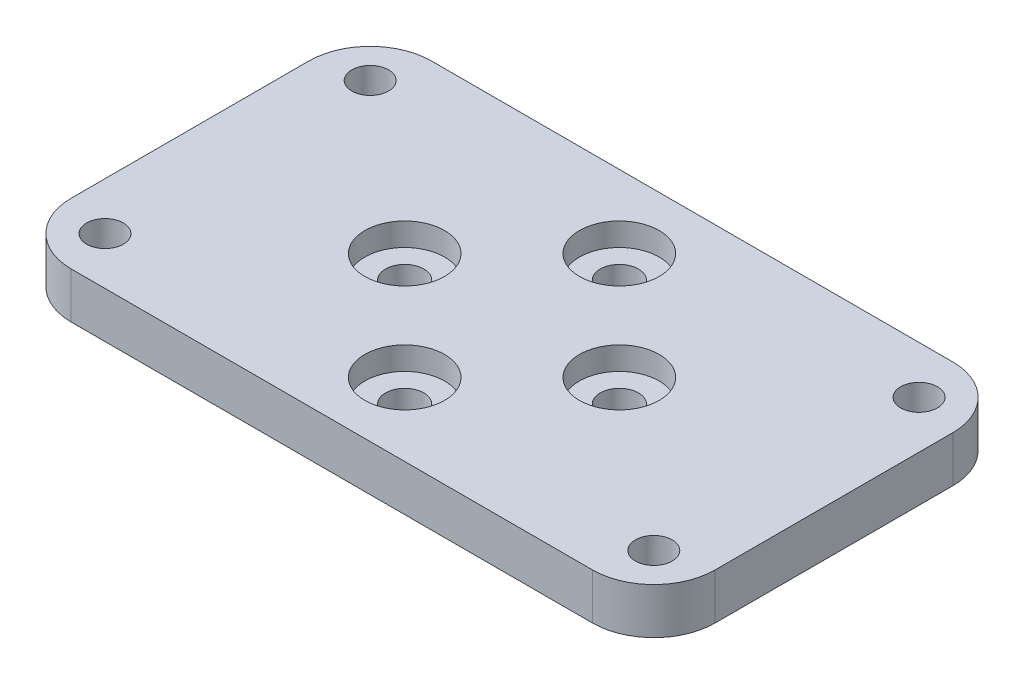
ISO-10303-21;
HEADER;
FILE_DESCRIPTION(('STEP AP214'),'2;1');
FILE_NAME('part.step','',(''),(''),'','','');
FILE_SCHEMA(('AUTOMOTIVE_DESIGN { 1 0 10303 214 1 1 1 1 }'));
ENDSEC;
DATA;
#1=APPLICATION_CONTEXT('core data for automotive mechanical design processes');
#2=APPLICATION_PROTOCOL_DEFINITION('international standard','automotive_design',2000,#1);
#3=PRODUCT_CONTEXT('',#1,'mechanical');
#4=PRODUCT('Part','Part','',(#3));
#5=PRODUCT_RELATED_PRODUCT_CATEGORY('part','',(#4));
#6=PRODUCT_DEFINITION_FORMATION('','',#4);
#7=PRODUCT_DEFINITION_CONTEXT('part definition',#1,'design');
#8=PRODUCT_DEFINITION('design','',#6,#7);
#9=PRODUCT_DEFINITION_SHAPE('','',#8);
#10=(LENGTH_UNIT() NAMED_UNIT(*) SI_UNIT(.MILLI.,.METRE.));
#11=(NAMED_UNIT(*) PLANE_ANGLE_UNIT() SI_UNIT($,.RADIAN.));
#12=(NAMED_UNIT(*) SI_UNIT($,.STERADIAN.) SOLID_ANGLE_UNIT());
#13=UNCERTAINTY_MEASURE_WITH_UNIT(LENGTH_MEASURE(1.E-05),#10,'distance_accuracy_value','');
#14=(GEOMETRIC_REPRESENTATION_CONTEXT(3) GLOBAL_UNCERTAINTY_ASSIGNED_CONTEXT((#13)) GLOBAL_UNIT_ASSIGNED_CONTEXT((#10,
#11,#12)) REPRESENTATION_CONTEXT('',''));
#15=CARTESIAN_POINT('',(0.,0.,0.));
#16=DIRECTION('',(0.,0.,1.));
#17=DIRECTION('',(1.,0.,0.));
#18=AXIS2_PLACEMENT_3D('',#15,#16,#17);
#19=CARTESIAN_POINT('',(7.,3.,0.));
#20=DIRECTION('',(0.,-1.,0.));
#21=DIRECTION('',(0.,0.,-1.));
#22=AXIS2_PLACEMENT_3D('',#19,#20,#21);
#23=CYLINDRICAL_SURFACE('',#22,1.25);
#24=CARTESIAN_POINT('',(7.,0.,0.));
#25=DIRECTION('',(0.,1.,0.));
#26=DIRECTION('',(0.,0.,1.));
#27=AXIS2_PLACEMENT_3D('',#24,#25,#26);
#28=CIRCLE('',#27,1.25);
#29=CARTESIAN_POINT('',(7.,0.,1.25));
#30=VERTEX_POINT('',#29);
#31=EDGE_CURVE('E141',#30,#30,#28,.T.);
#32=ORIENTED_EDGE('',*,*,#31,.F.);
#33=EDGE_LOOP('',(#32));
#34=FACE_BOUND('',#33,.T.);
#35=CARTESIAN_POINT('',(7.,1.5,0.));
#36=DIRECTION('',(0.,1.,0.));
#37=DIRECTION('',(0.,0.,1.));
#38=AXIS2_PLACEMENT_3D('',#35,#36,#37);
#39=CIRCLE('',#38,1.25);
#40=CARTESIAN_POINT('',(7.,1.5,1.25));
#41=VERTEX_POINT('',#40);
#42=EDGE_CURVE('E45',#41,#41,#39,.T.);
#43=ORIENTED_EDGE('',*,*,#42,.T.);
#44=EDGE_LOOP('',(#43));
#45=FACE_BOUND('',#44,.T.);
#46=ADVANCED_FACE('F41',(#34,#45),#23,.F.);
#47=CARTESIAN_POINT('',(0.,3.,7.));
#48=DIRECTION('',(0.,-1.,0.));
#49=DIRECTION('',(0.,0.,-1.));
#50=AXIS2_PLACEMENT_3D('',#47,#48,#49);
#51=CYLINDRICAL_SURFACE('',#50,1.25);
#52=CARTESIAN_POINT('',(0.,0.,7.));
#53=DIRECTION('',(0.,1.,0.));
#54=DIRECTION('',(0.,0.,1.));
#55=AXIS2_PLACEMENT_3D('',#52,#53,#54);
#56=CIRCLE('',#55,1.25);
#57=CARTESIAN_POINT('',(0.,0.,8.25));
#58=VERTEX_POINT('',#57);
#59=EDGE_CURVE('E247',#58,#58,#56,.T.);
#60=ORIENTED_EDGE('',*,*,#59,.F.);
#61=EDGE_LOOP('',(#60));
#62=FACE_BOUND('',#61,.T.);
#63=CARTESIAN_POINT('',(0.,1.5,7.));
#64=DIRECTION('',(0.,1.,0.));
#65=DIRECTION('',(0.,0.,1.));
#66=AXIS2_PLACEMENT_3D('',#63,#64,#65);
#67=CIRCLE('',#66,1.25);
#68=CARTESIAN_POINT('',(0.,1.5,8.25));
#69=VERTEX_POINT('',#68);
#70=EDGE_CURVE('E202',#69,#69,#67,.T.);
#71=ORIENTED_EDGE('',*,*,#70,.T.);
#72=EDGE_LOOP('',(#71));
#73=FACE_BOUND('',#72,.T.);
#74=ADVANCED_FACE('F296',(#62,#73),#51,.F.);
#75=CARTESIAN_POINT('',(-7.,3.,0.));
#76=DIRECTION('',(0.,-1.,0.));
#77=DIRECTION('',(0.,0.,-1.));
#78=AXIS2_PLACEMENT_3D('',#75,#76,#77);
#79=CYLINDRICAL_SURFACE('',#78,1.25);
#80=CARTESIAN_POINT('',(-7.,0.,0.));
#81=DIRECTION('',(0.,1.,0.));
#82=DIRECTION('',(0.,0.,1.));
#83=AXIS2_PLACEMENT_3D('',#80,#81,#82);
#84=CIRCLE('',#83,1.25);
#85=CARTESIAN_POINT('',(-7.,0.,1.24999999999995));
#86=VERTEX_POINT('',#85);
#87=EDGE_CURVE('E243',#86,#86,#84,.T.);
#88=ORIENTED_EDGE('',*,*,#87,.F.);
#89=EDGE_LOOP('',(#88));
#90=FACE_BOUND('',#89,.T.);
#91=CARTESIAN_POINT('',(-7.,1.5,0.));
#92=DIRECTION('',(0.,1.,0.));
#93=DIRECTION('',(0.,0.,1.));
#94=AXIS2_PLACEMENT_3D('',#91,#92,#93);
#95=CIRCLE('',#94,1.25);
#96=CARTESIAN_POINT('',(-7.,1.5,1.24999999999995));
#97=VERTEX_POINT('',#96);
#98=EDGE_CURVE('E198',#97,#97,#95,.T.);
#99=ORIENTED_EDGE('',*,*,#98,.T.);
#100=EDGE_LOOP('',(#99));
#101=FACE_BOUND('',#100,.T.);
#102=ADVANCED_FACE('F302',(#90,#101),#79,.F.);
#103=CARTESIAN_POINT('',(0.,3.,-7.));
#104=DIRECTION('',(0.,-1.,0.));
#105=DIRECTION('',(0.,0.,-1.));
#106=AXIS2_PLACEMENT_3D('',#103,#104,#105);
#107=CYLINDRICAL_SURFACE('',#106,1.25);
#108=CARTESIAN_POINT('',(0.,0.,-7.));
#109=DIRECTION('',(0.,1.,0.));
#110=DIRECTION('',(0.,0.,1.));
#111=AXIS2_PLACEMENT_3D('',#108,#109,#110);
#112=CIRCLE('',#111,1.25);
#113=CARTESIAN_POINT('',(0.,0.,-5.75));
#114=VERTEX_POINT('',#113);
#115=EDGE_CURVE('E236',#114,#114,#112,.T.);
#116=ORIENTED_EDGE('',*,*,#115,.F.);
#117=EDGE_LOOP('',(#116));
#118=FACE_BOUND('',#117,.T.);
#119=CARTESIAN_POINT('',(0.,1.5,-7.));
#120=DIRECTION('',(0.,1.,0.));
#121=DIRECTION('',(0.,0.,1.));
#122=AXIS2_PLACEMENT_3D('',#119,#120,#121);
#123=CIRCLE('',#122,1.25);
#124=CARTESIAN_POINT('',(0.,1.5,-5.75));
#125=VERTEX_POINT('',#124);
#126=EDGE_CURVE('E194',#125,#125,#123,.T.);
#127=ORIENTED_EDGE('',*,*,#126,.T.);
#128=EDGE_LOOP('',(#127));
#129=FACE_BOUND('',#128,.T.);
#130=ADVANCED_FACE('F311',(#118,#129),#107,.F.);
#131=CARTESIAN_POINT('',(0.,3.,0.));
#132=DIRECTION('',(0.,1.,0.));
#133=DIRECTION('',(0.,0.,1.));
#134=AXIS2_PLACEMENT_3D('',#131,#132,#133);
#135=PLANE('',#134);
#136=CARTESIAN_POINT('',(7.,3.,0.));
#137=DIRECTION('',(0.,1.,0.));
#138=DIRECTION('',(0.,0.,1.));
#139=AXIS2_PLACEMENT_3D('',#136,#137,#138);
#140=CIRCLE('',#139,2.6);
#141=CARTESIAN_POINT('',(7.,3.,2.6));
#142=VERTEX_POINT('',#141);
#143=EDGE_CURVE('E511',#142,#142,#140,.T.);
#144=ORIENTED_EDGE('',*,*,#143,.F.);
#145=EDGE_LOOP('',(#144));
#146=FACE_BOUND('',#145,.T.);
#147=CARTESIAN_POINT('',(0.,3.,7.));
#148=DIRECTION('',(0.,1.,0.));
#149=DIRECTION('',(0.,0.,1.));
#150=AXIS2_PLACEMENT_3D('',#147,#148,#149);
#151=CIRCLE('',#150,2.6);
#152=CARTESIAN_POINT('',(0.,3.,9.6));
#153=VERTEX_POINT('',#152);
#154=EDGE_CURVE('E521',#153,#153,#151,.T.);
#155=ORIENTED_EDGE('',*,*,#154,.F.);
#156=EDGE_LOOP('',(#155));
#157=FACE_BOUND('',#156,.T.);
#158=CARTESIAN_POINT('',(-7.,3.,0.));
#159=DIRECTION('',(0.,1.,0.));
#160=DIRECTION('',(0.,0.,1.));
#161=AXIS2_PLACEMENT_3D('',#158,#159,#160);
#162=CIRCLE('',#161,2.6);
#163=CARTESIAN_POINT('',(-7.,3.,2.59999999999995));
#164=VERTEX_POINT('',#163);
#165=EDGE_CURVE('E529',#164,#164,#162,.T.);
#166=ORIENTED_EDGE('',*,*,#165,.F.);
#167=EDGE_LOOP('',(#166));
#168=FACE_BOUND('',#167,.T.);
#169=CARTESIAN_POINT('',(0.,3.,-7.));
#170=DIRECTION('',(0.,1.,0.));
#171=DIRECTION('',(0.,0.,1.));
#172=AXIS2_PLACEMENT_3D('',#169,#170,#171);
#173=CIRCLE('',#172,2.6);
#174=CARTESIAN_POINT('',(0.,3.,-4.4));
#175=VERTEX_POINT('',#174);
#176=EDGE_CURVE('E536',#175,#175,#173,.T.);
#177=ORIENTED_EDGE('',*,*,#176,.F.);
#178=EDGE_LOOP('',(#177));
#179=FACE_BOUND('',#178,.T.);
#180=CARTESIAN_POINT('',(-17.9,3.,8.65));
#181=DIRECTION('',(0.,1.,0.));
#182=DIRECTION('',(0.,0.,-1.));
#183=AXIS2_PLACEMENT_3D('',#180,#181,#182);
#184=CIRCLE('',#183,1.2);
#185=CARTESIAN_POINT('',(-17.9,3.,7.45));
#186=VERTEX_POINT('',#185);
#187=EDGE_CURVE('E224',#186,#186,#184,.T.);
#188=ORIENTED_EDGE('',*,*,#187,.F.);
#189=EDGE_LOOP('',(#188));
#190=FACE_BOUND('',#189,.T.);
#191=DIRECTION('',(-1.,0.,0.));
#192=VECTOR('',#191,1.);
#193=CARTESIAN_POINT('',(21.,3.,-11.75));
#194=LINE('',#193,#192);
#195=CARTESIAN_POINT('',(17.,3.,-11.75));
#196=VERTEX_POINT('',#195);
#197=CARTESIAN_POINT('',(-17.,3.,-11.75));
#198=VERTEX_POINT('',#197);
#199=EDGE_CURVE('E152',#196,#198,#194,.T.);
#200=ORIENTED_EDGE('',*,*,#199,.T.);
#201=CARTESIAN_POINT('',(-17.,3.,-7.75));
#202=DIRECTION('',(0.,1.,0.));
#203=DIRECTION('',(0.,0.,1.));
#204=AXIS2_PLACEMENT_3D('',#201,#202,#203);
#205=CIRCLE('',#204,4.);
#206=CARTESIAN_POINT('',(-21.,3.,-7.75));
#207=VERTEX_POINT('',#206);
#208=EDGE_CURVE('E182',#198,#207,#205,.T.);
#209=ORIENTED_EDGE('',*,*,#208,.T.);
#210=DIRECTION('',(0.,0.,1.));
#211=VECTOR('',#210,1.);
#212=CARTESIAN_POINT('',(-21.,3.,11.75));
#213=LINE('',#212,#211);
#214=CARTESIAN_POINT('',(-21.,3.,7.75));
#215=VERTEX_POINT('',#214);
#216=EDGE_CURVE('E131',#207,#215,#213,.T.);
#217=ORIENTED_EDGE('',*,*,#216,.T.);
#218=CARTESIAN_POINT('',(-17.,3.,7.75));
#219=DIRECTION('',(0.,1.,0.));
#220=DIRECTION('',(0.,0.,1.));
#221=AXIS2_PLACEMENT_3D('',#218,#219,#220);
#222=CIRCLE('',#221,4.);
#223=CARTESIAN_POINT('',(-17.,3.,11.75));
#224=VERTEX_POINT('',#223);
#225=EDGE_CURVE('E179',#215,#224,#222,.T.);
#226=ORIENTED_EDGE('',*,*,#225,.T.);
#227=DIRECTION('',(1.,0.,0.));
#228=VECTOR('',#227,1.);
#229=CARTESIAN_POINT('',(21.,3.,11.75));
#230=LINE('',#229,#228);
#231=CARTESIAN_POINT('',(17.,3.,11.75));
#232=VERTEX_POINT('',#231);
#233=EDGE_CURVE('E260',#224,#232,#230,.T.);
#234=ORIENTED_EDGE('',*,*,#233,.T.);
#235=CARTESIAN_POINT('',(17.,3.,7.75));
#236=DIRECTION('',(0.,1.,0.));
#237=DIRECTION('',(0.,0.,1.));
#238=AXIS2_PLACEMENT_3D('',#235,#236,#237);
#239=CIRCLE('',#238,4.);
#240=CARTESIAN_POINT('',(21.,3.,7.75));
#241=VERTEX_POINT('',#240);
#242=EDGE_CURVE('E65',#232,#241,#239,.T.);
#243=ORIENTED_EDGE('',*,*,#242,.T.);
#244=DIRECTION('',(0.,0.,-1.));
#245=VECTOR('',#244,1.);
#246=CARTESIAN_POINT('',(21.,3.,11.75));
#247=LINE('',#246,#245);
#248=CARTESIAN_POINT('',(21.,3.,-7.75));
#249=VERTEX_POINT('',#248);
#250=EDGE_CURVE('E262',#241,#249,#247,.T.);
#251=ORIENTED_EDGE('',*,*,#250,.T.);
#252=CARTESIAN_POINT('',(17.,3.,-7.75));
#253=DIRECTION('',(0.,1.,0.));
#254=DIRECTION('',(0.,0.,1.));
#255=AXIS2_PLACEMENT_3D('',#252,#253,#254);
#256=CIRCLE('',#255,4.);
#257=EDGE_CURVE('E174',#249,#196,#256,.T.);
#258=ORIENTED_EDGE('',*,*,#257,.T.);
#259=EDGE_LOOP('',(#200,#209,#217,#226,#234,#243,#251,#258));
#260=FACE_BOUND('',#259,.T.);
#261=CARTESIAN_POINT('',(-17.9,3.,-8.65));
#262=DIRECTION('',(0.,1.,0.));
#263=DIRECTION('',(0.,0.,1.));
#264=AXIS2_PLACEMENT_3D('',#261,#262,#263);
#265=CIRCLE('',#264,1.2);
#266=CARTESIAN_POINT('',(-17.9,3.,-7.45));
#267=VERTEX_POINT('',#266);
#268=EDGE_CURVE('E149',#267,#267,#265,.T.);
#269=ORIENTED_EDGE('',*,*,#268,.F.);
#270=EDGE_LOOP('',(#269));
#271=FACE_BOUND('',#270,.T.);
#272=CARTESIAN_POINT('',(17.9,3.,-8.65000000000001));
#273=DIRECTION('',(0.,1.,0.));
#274=DIRECTION('',(0.,0.,-1.));
#275=AXIS2_PLACEMENT_3D('',#272,#273,#274);
#276=CIRCLE('',#275,1.2);
#277=CARTESIAN_POINT('',(17.9,3.,-9.85));
#278=VERTEX_POINT('',#277);
#279=EDGE_CURVE('E232',#278,#278,#276,.T.);
#280=ORIENTED_EDGE('',*,*,#279,.F.);
#281=EDGE_LOOP('',(#280));
#282=FACE_BOUND('',#281,.T.);
#283=CARTESIAN_POINT('',(17.9,3.,8.65000000000001));
#284=DIRECTION('',(0.,1.,0.));
#285=DIRECTION('',(0.,0.,1.));
#286=AXIS2_PLACEMENT_3D('',#283,#284,#285);
#287=CIRCLE('',#286,1.2);
#288=CARTESIAN_POINT('',(17.9,3.,9.85));
#289=VERTEX_POINT('',#288);
#290=EDGE_CURVE('E214',#289,#289,#287,.T.);
#291=ORIENTED_EDGE('',*,*,#290,.F.);
#292=EDGE_LOOP('',(#291));
#293=FACE_BOUND('',#292,.T.);
#294=ADVANCED_FACE('F268',(#146,#157,#168,#179,#190,#260,#271,#282,#293),#135,.T.);
#295=CARTESIAN_POINT('',(0.,0.,0.));
#296=DIRECTION('',(0.,1.,0.));
#297=DIRECTION('',(0.,0.,1.));
#298=AXIS2_PLACEMENT_3D('',#295,#296,#297);
#299=PLANE('',#298);
#300=DIRECTION('',(0.,0.,1.));
#301=VECTOR('',#300,1.);
#302=CARTESIAN_POINT('',(-21.,0.,11.75));
#303=LINE('',#302,#301);
#304=CARTESIAN_POINT('',(-21.,0.,-7.75));
#305=VERTEX_POINT('',#304);
#306=CARTESIAN_POINT('',(-21.,0.,7.75));
#307=VERTEX_POINT('',#306);
#308=EDGE_CURVE('E128',#305,#307,#303,.T.);
#309=ORIENTED_EDGE('',*,*,#308,.F.);
#310=CARTESIAN_POINT('',(-17.,0.,-7.75));
#311=DIRECTION('',(0.,1.,0.));
#312=DIRECTION('',(0.,0.,1.));
#313=AXIS2_PLACEMENT_3D('',#310,#311,#312);
#314=CIRCLE('',#313,4.);
#315=CARTESIAN_POINT('',(-17.,0.,-11.75));
#316=VERTEX_POINT('',#315);
#317=EDGE_CURVE('E110',#305,#316,#314,.F.);
#318=ORIENTED_EDGE('',*,*,#317,.T.);
#319=DIRECTION('',(-1.,0.,0.));
#320=VECTOR('',#319,1.);
#321=CARTESIAN_POINT('',(21.,0.,-11.75));
#322=LINE('',#321,#320);
#323=CARTESIAN_POINT('',(17.,0.,-11.75));
#324=VERTEX_POINT('',#323);
#325=EDGE_CURVE('E157',#324,#316,#322,.T.);
#326=ORIENTED_EDGE('',*,*,#325,.F.);
#327=CARTESIAN_POINT('',(17.,0.,-7.75));
#328=DIRECTION('',(0.,1.,0.));
#329=DIRECTION('',(0.,0.,1.));
#330=AXIS2_PLACEMENT_3D('',#327,#328,#329);
#331=CIRCLE('',#330,4.);
#332=CARTESIAN_POINT('',(21.,0.,-7.75));
#333=VERTEX_POINT('',#332);
#334=EDGE_CURVE('E133',#324,#333,#331,.F.);
#335=ORIENTED_EDGE('',*,*,#334,.T.);
#336=DIRECTION('',(0.,0.,-1.));
#337=VECTOR('',#336,1.);
#338=CARTESIAN_POINT('',(21.,0.,11.75));
#339=LINE('',#338,#337);
#340=CARTESIAN_POINT('',(21.,0.,7.75));
#341=VERTEX_POINT('',#340);
#342=EDGE_CURVE('E146',#341,#333,#339,.T.);
#343=ORIENTED_EDGE('',*,*,#342,.F.);
#344=CARTESIAN_POINT('',(17.,0.,7.75));
#345=DIRECTION('',(0.,1.,0.));
#346=DIRECTION('',(0.,0.,1.));
#347=AXIS2_PLACEMENT_3D('',#344,#345,#346);
#348=CIRCLE('',#347,4.);
#349=CARTESIAN_POINT('',(17.,0.,11.75));
#350=VERTEX_POINT('',#349);
#351=EDGE_CURVE('E164',#341,#350,#348,.F.);
#352=ORIENTED_EDGE('',*,*,#351,.T.);
#353=DIRECTION('',(1.,0.,0.));
#354=VECTOR('',#353,1.);
#355=CARTESIAN_POINT('',(21.,0.,11.75));
#356=LINE('',#355,#354);
#357=CARTESIAN_POINT('',(-17.,0.,11.75));
#358=VERTEX_POINT('',#357);
#359=EDGE_CURVE('E140',#358,#350,#356,.T.);
#360=ORIENTED_EDGE('',*,*,#359,.F.);
#361=CARTESIAN_POINT('',(-17.,0.,7.75));
#362=DIRECTION('',(0.,1.,0.));
#363=DIRECTION('',(0.,0.,1.));
#364=AXIS2_PLACEMENT_3D('',#361,#362,#363);
#365=CIRCLE('',#364,4.);
#366=EDGE_CURVE('E122',#358,#307,#365,.F.);
#367=ORIENTED_EDGE('',*,*,#366,.T.);
#368=EDGE_LOOP('',(#309,#318,#326,#335,#343,#352,#360,#367));
#369=FACE_BOUND('',#368,.T.);
#370=ORIENTED_EDGE('',*,*,#31,.T.);
#371=EDGE_LOOP('',(#370));
#372=FACE_BOUND('',#371,.T.);
#373=CARTESIAN_POINT('',(-17.9,0.,-8.65));
#374=DIRECTION('',(0.,1.,0.));
#375=DIRECTION('',(0.,0.,1.));
#376=AXIS2_PLACEMENT_3D('',#373,#374,#375);
#377=CIRCLE('',#376,1.2);
#378=CARTESIAN_POINT('',(-17.9,0.,-7.45));
#379=VERTEX_POINT('',#378);
#380=EDGE_CURVE('E251',#379,#379,#377,.T.);
#381=ORIENTED_EDGE('',*,*,#380,.T.);
#382=EDGE_LOOP('',(#381));
#383=FACE_BOUND('',#382,.T.);
#384=ORIENTED_EDGE('',*,*,#59,.T.);
#385=EDGE_LOOP('',(#384));
#386=FACE_BOUND('',#385,.T.);
#387=ORIENTED_EDGE('',*,*,#87,.T.);
#388=EDGE_LOOP('',(#387));
#389=FACE_BOUND('',#388,.T.);
#390=ORIENTED_EDGE('',*,*,#115,.T.);
#391=EDGE_LOOP('',(#390));
#392=FACE_BOUND('',#391,.T.);
#393=CARTESIAN_POINT('',(17.9,0.,-8.65000000000001));
#394=DIRECTION('',(0.,1.,0.));
#395=DIRECTION('',(0.,0.,-1.));
#396=AXIS2_PLACEMENT_3D('',#393,#394,#395);
#397=CIRCLE('',#396,1.2);
#398=CARTESIAN_POINT('',(17.9,0.,-9.85));
#399=VERTEX_POINT('',#398);
#400=EDGE_CURVE('E228',#399,#399,#397,.T.);
#401=ORIENTED_EDGE('',*,*,#400,.T.);
#402=EDGE_LOOP('',(#401));
#403=FACE_BOUND('',#402,.T.);
#404=CARTESIAN_POINT('',(-17.9,0.,8.65));
#405=DIRECTION('',(0.,1.,0.));
#406=DIRECTION('',(0.,0.,-1.));
#407=AXIS2_PLACEMENT_3D('',#404,#405,#406);
#408=CIRCLE('',#407,1.2);
#409=CARTESIAN_POINT('',(-17.9,0.,7.45));
#410=VERTEX_POINT('',#409);
#411=EDGE_CURVE('E220',#410,#410,#408,.T.);
#412=ORIENTED_EDGE('',*,*,#411,.T.);
#413=EDGE_LOOP('',(#412));
#414=FACE_BOUND('',#413,.T.);
#415=CARTESIAN_POINT('',(17.9,0.,8.65000000000001));
#416=DIRECTION('',(0.,1.,0.));
#417=DIRECTION('',(0.,0.,1.));
#418=AXIS2_PLACEMENT_3D('',#415,#416,#417);
#419=CIRCLE('',#418,1.2);
#420=CARTESIAN_POINT('',(17.9,0.,9.85));
#421=VERTEX_POINT('',#420);
#422=EDGE_CURVE('E209',#421,#421,#419,.T.);
#423=ORIENTED_EDGE('',*,*,#422,.T.);
#424=EDGE_LOOP('',(#423));
#425=FACE_BOUND('',#424,.T.);
#426=ADVANCED_FACE('F136',(#369,#372,#383,#386,#389,#392,#403,#414,#425),#299,.F.);
#427=CARTESIAN_POINT('',(-21.,3.,11.75));
#428=DIRECTION('',(1.,0.,0.));
#429=DIRECTION('',(0.,0.,-1.));
#430=AXIS2_PLACEMENT_3D('',#427,#428,#429);
#431=PLANE('',#430);
#432=ORIENTED_EDGE('',*,*,#216,.F.);
#433=DIRECTION('',(0.,-1.,0.));
#434=VECTOR('',#433,1.);
#435=CARTESIAN_POINT('',(-21.,3.,-7.75));
#436=LINE('',#435,#434);
#437=EDGE_CURVE('E114',#207,#305,#436,.T.);
#438=ORIENTED_EDGE('',*,*,#437,.T.);
#439=ORIENTED_EDGE('',*,*,#308,.T.);
#440=DIRECTION('',(0.,-1.,0.));
#441=VECTOR('',#440,1.);
#442=CARTESIAN_POINT('',(-21.,3.,7.75));
#443=LINE('',#442,#441);
#444=EDGE_CURVE('E134',#307,#215,#443,.F.);
#445=ORIENTED_EDGE('',*,*,#444,.T.);
#446=EDGE_LOOP('',(#432,#438,#439,#445));
#447=FACE_BOUND('',#446,.T.);
#448=ADVANCED_FACE('F127',(#447),#431,.F.);
#449=CARTESIAN_POINT('',(21.,3.,11.75));
#450=DIRECTION('',(0.,0.,-1.));
#451=DIRECTION('',(-1.,0.,0.));
#452=AXIS2_PLACEMENT_3D('',#449,#450,#451);
#453=PLANE('',#452);
#454=ORIENTED_EDGE('',*,*,#233,.F.);
#455=DIRECTION('',(0.,-1.,0.));
#456=VECTOR('',#455,1.);
#457=CARTESIAN_POINT('',(-17.,3.,11.75));
#458=LINE('',#457,#456);
#459=EDGE_CURVE('E188',#224,#358,#458,.T.);
#460=ORIENTED_EDGE('',*,*,#459,.T.);
#461=ORIENTED_EDGE('',*,*,#359,.T.);
#462=DIRECTION('',(0.,-1.,0.));
#463=VECTOR('',#462,1.);
#464=CARTESIAN_POINT('',(17.,3.,11.75));
#465=LINE('',#464,#463);
#466=EDGE_CURVE('E185',#350,#232,#465,.F.);
#467=ORIENTED_EDGE('',*,*,#466,.T.);
#468=EDGE_LOOP('',(#454,#460,#461,#467));
#469=FACE_BOUND('',#468,.T.);
#470=ADVANCED_FACE('F282',(#469),#453,.F.);
#471=CARTESIAN_POINT('',(21.,3.,11.75));
#472=DIRECTION('',(-1.,0.,0.));
#473=DIRECTION('',(0.,0.,1.));
#474=AXIS2_PLACEMENT_3D('',#471,#472,#473);
#475=PLANE('',#474);
#476=ORIENTED_EDGE('',*,*,#250,.F.);
#477=DIRECTION('',(0.,-1.,0.));
#478=VECTOR('',#477,1.);
#479=CARTESIAN_POINT('',(21.,3.,7.75));
#480=LINE('',#479,#478);
#481=EDGE_CURVE('E11',#241,#341,#480,.T.);
#482=ORIENTED_EDGE('',*,*,#481,.T.);
#483=ORIENTED_EDGE('',*,*,#342,.T.);
#484=DIRECTION('',(0.,-1.,0.));
#485=VECTOR('',#484,1.);
#486=CARTESIAN_POINT('',(21.,3.,-7.75));
#487=LINE('',#486,#485);
#488=EDGE_CURVE('E51',#333,#249,#487,.F.);
#489=ORIENTED_EDGE('',*,*,#488,.T.);
#490=EDGE_LOOP('',(#476,#482,#483,#489));
#491=FACE_BOUND('',#490,.T.);
#492=ADVANCED_FACE('F275',(#491),#475,.F.);
#493=CARTESIAN_POINT('',(21.,3.,-11.75));
#494=DIRECTION('',(0.,0.,1.));
#495=DIRECTION('',(1.,0.,0.));
#496=AXIS2_PLACEMENT_3D('',#493,#494,#495);
#497=PLANE('',#496);
#498=ORIENTED_EDGE('',*,*,#325,.T.);
#499=DIRECTION('',(0.,-1.,0.));
#500=VECTOR('',#499,1.);
#501=CARTESIAN_POINT('',(-17.,3.,-11.75));
#502=LINE('',#501,#500);
#503=EDGE_CURVE('E115',#316,#198,#502,.F.);
#504=ORIENTED_EDGE('',*,*,#503,.T.);
#505=ORIENTED_EDGE('',*,*,#199,.F.);
#506=DIRECTION('',(0.,-1.,0.));
#507=VECTOR('',#506,1.);
#508=CARTESIAN_POINT('',(17.,3.,-11.75));
#509=LINE('',#508,#507);
#510=EDGE_CURVE('E121',#196,#324,#509,.T.);
#511=ORIENTED_EDGE('',*,*,#510,.T.);
#512=EDGE_LOOP('',(#498,#504,#505,#511));
#513=FACE_BOUND('',#512,.T.);
#514=ADVANCED_FACE('F272',(#513),#497,.F.);
#515=CARTESIAN_POINT('',(-17.9,3.,-8.65));
#516=DIRECTION('',(0.,-1.,0.));
#517=DIRECTION('',(0.,0.,-1.));
#518=AXIS2_PLACEMENT_3D('',#515,#516,#517);
#519=CYLINDRICAL_SURFACE('',#518,1.2);
#520=ORIENTED_EDGE('',*,*,#268,.T.);
#521=EDGE_LOOP('',(#520));
#522=FACE_BOUND('',#521,.T.);
#523=ORIENTED_EDGE('',*,*,#380,.F.);
#524=EDGE_LOOP('',(#523));
#525=FACE_BOUND('',#524,.T.);
#526=ADVANCED_FACE('F308',(#522,#525),#519,.F.);
#527=CARTESIAN_POINT('',(17.9,3.,-8.65000000000001));
#528=DIRECTION('',(0.,-1.,0.));
#529=DIRECTION('',(0.,0.,-1.));
#530=AXIS2_PLACEMENT_3D('',#527,#528,#529);
#531=CYLINDRICAL_SURFACE('',#530,1.2);
#532=ORIENTED_EDGE('',*,*,#279,.T.);
#533=EDGE_LOOP('',(#532));
#534=FACE_BOUND('',#533,.T.);
#535=ORIENTED_EDGE('',*,*,#400,.F.);
#536=EDGE_LOOP('',(#535));
#537=FACE_BOUND('',#536,.T.);
#538=ADVANCED_FACE('F345',(#534,#537),#531,.F.);
#539=CARTESIAN_POINT('',(-17.9,3.,8.65));
#540=DIRECTION('',(0.,-1.,0.));
#541=DIRECTION('',(0.,0.,-1.));
#542=AXIS2_PLACEMENT_3D('',#539,#540,#541);
#543=CYLINDRICAL_SURFACE('',#542,1.2);
#544=ORIENTED_EDGE('',*,*,#187,.T.);
#545=EDGE_LOOP('',(#544));
#546=FACE_BOUND('',#545,.T.);
#547=ORIENTED_EDGE('',*,*,#411,.F.);
#548=EDGE_LOOP('',(#547));
#549=FACE_BOUND('',#548,.T.);
#550=ADVANCED_FACE('F352',(#546,#549),#543,.F.);
#551=CARTESIAN_POINT('',(17.9,3.,8.65000000000001));
#552=DIRECTION('',(0.,-1.,0.));
#553=DIRECTION('',(0.,0.,-1.));
#554=AXIS2_PLACEMENT_3D('',#551,#552,#553);
#555=CYLINDRICAL_SURFACE('',#554,1.2);
#556=ORIENTED_EDGE('',*,*,#290,.T.);
#557=EDGE_LOOP('',(#556));
#558=FACE_BOUND('',#557,.T.);
#559=ORIENTED_EDGE('',*,*,#422,.F.);
#560=EDGE_LOOP('',(#559));
#561=FACE_BOUND('',#560,.T.);
#562=ADVANCED_FACE('F293',(#558,#561),#555,.F.);
#563=CARTESIAN_POINT('',(-17.,3.,-7.75));
#564=DIRECTION('',(0.,-1.,0.));
#565=DIRECTION('',(0.,0.,-1.));
#566=AXIS2_PLACEMENT_3D('',#563,#564,#565);
#567=CYLINDRICAL_SURFACE('',#566,4.);
#568=ORIENTED_EDGE('',*,*,#208,.F.);
#569=ORIENTED_EDGE('',*,*,#503,.F.);
#570=ORIENTED_EDGE('',*,*,#317,.F.);
#571=ORIENTED_EDGE('',*,*,#437,.F.);
#572=EDGE_LOOP('',(#568,#569,#570,#571));
#573=FACE_BOUND('',#572,.T.);
#574=ADVANCED_FACE('F113',(#573),#567,.T.);
#575=CARTESIAN_POINT('',(-17.,3.,7.75));
#576=DIRECTION('',(0.,-1.,0.));
#577=DIRECTION('',(0.,0.,-1.));
#578=AXIS2_PLACEMENT_3D('',#575,#576,#577);
#579=CYLINDRICAL_SURFACE('',#578,4.);
#580=ORIENTED_EDGE('',*,*,#225,.F.);
#581=ORIENTED_EDGE('',*,*,#444,.F.);
#582=ORIENTED_EDGE('',*,*,#366,.F.);
#583=ORIENTED_EDGE('',*,*,#459,.F.);
#584=EDGE_LOOP('',(#580,#581,#582,#583));
#585=FACE_BOUND('',#584,.T.);
#586=ADVANCED_FACE('F286',(#585),#579,.T.);
#587=CARTESIAN_POINT('',(17.,3.,7.75));
#588=DIRECTION('',(0.,-1.,0.));
#589=DIRECTION('',(0.,0.,-1.));
#590=AXIS2_PLACEMENT_3D('',#587,#588,#589);
#591=CYLINDRICAL_SURFACE('',#590,4.);
#592=ORIENTED_EDGE('',*,*,#242,.F.);
#593=ORIENTED_EDGE('',*,*,#466,.F.);
#594=ORIENTED_EDGE('',*,*,#351,.F.);
#595=ORIENTED_EDGE('',*,*,#481,.F.);
#596=EDGE_LOOP('',(#592,#593,#594,#595));
#597=FACE_BOUND('',#596,.T.);
#598=ADVANCED_FACE('F278',(#597),#591,.T.);
#599=CARTESIAN_POINT('',(17.,3.,-7.75));
#600=DIRECTION('',(0.,-1.,0.));
#601=DIRECTION('',(0.,0.,-1.));
#602=AXIS2_PLACEMENT_3D('',#599,#600,#601);
#603=CYLINDRICAL_SURFACE('',#602,4.);
#604=ORIENTED_EDGE('',*,*,#257,.F.);
#605=ORIENTED_EDGE('',*,*,#488,.F.);
#606=ORIENTED_EDGE('',*,*,#334,.F.);
#607=ORIENTED_EDGE('',*,*,#510,.F.);
#608=EDGE_LOOP('',(#604,#605,#606,#607));
#609=FACE_BOUND('',#608,.T.);
#610=ADVANCED_FACE('F43',(#609),#603,.T.);
#611=CARTESIAN_POINT('',(0.,1.5,-7.));
#612=DIRECTION('',(0.,1.,0.));
#613=DIRECTION('',(0.,0.,1.));
#614=AXIS2_PLACEMENT_3D('',#611,#612,#613);
#615=CYLINDRICAL_SURFACE('',#614,2.6);
#616=CARTESIAN_POINT('',(0.,1.5,-7.));
#617=DIRECTION('',(0.,1.,0.));
#618=DIRECTION('',(0.,0.,1.));
#619=AXIS2_PLACEMENT_3D('',#616,#617,#618);
#620=CIRCLE('',#619,2.6);
#621=CARTESIAN_POINT('',(0.,1.5,-4.4));
#622=VERTEX_POINT('',#621);
#623=EDGE_CURVE('E533',#622,#622,#620,.T.);
#624=ORIENTED_EDGE('',*,*,#623,.F.);
#625=EDGE_LOOP('',(#624));
#626=FACE_BOUND('',#625,.T.);
#627=ORIENTED_EDGE('',*,*,#176,.T.);
#628=EDGE_LOOP('',(#627));
#629=FACE_BOUND('',#628,.T.);
#630=ADVANCED_FACE('F389',(#626,#629),#615,.F.);
#631=CARTESIAN_POINT('',(0.,1.5,-7.));
#632=DIRECTION('',(0.,1.,0.));
#633=DIRECTION('',(0.,0.,1.));
#634=AXIS2_PLACEMENT_3D('',#631,#632,#633);
#635=PLANE('',#634);
#636=ORIENTED_EDGE('',*,*,#126,.F.);
#637=EDGE_LOOP('',(#636));
#638=FACE_BOUND('',#637,.T.);
#639=ORIENTED_EDGE('',*,*,#623,.T.);
#640=EDGE_LOOP('',(#639));
#641=FACE_BOUND('',#640,.T.);
#642=ADVANCED_FACE('F433',(#638,#641),#635,.T.);
#643=CARTESIAN_POINT('',(-7.,1.5,0.));
#644=DIRECTION('',(0.,1.,0.));
#645=DIRECTION('',(0.,0.,1.));
#646=AXIS2_PLACEMENT_3D('',#643,#644,#645);
#647=CYLINDRICAL_SURFACE('',#646,2.6);
#648=CARTESIAN_POINT('',(-7.,1.5,0.));
#649=DIRECTION('',(0.,1.,0.));
#650=DIRECTION('',(0.,0.,1.));
#651=AXIS2_PLACEMENT_3D('',#648,#649,#650);
#652=CIRCLE('',#651,2.6);
#653=CARTESIAN_POINT('',(-7.,1.5,2.59999999999995));
#654=VERTEX_POINT('',#653);
#655=EDGE_CURVE('E525',#654,#654,#652,.T.);
#656=ORIENTED_EDGE('',*,*,#655,.F.);
#657=EDGE_LOOP('',(#656));
#658=FACE_BOUND('',#657,.T.);
#659=ORIENTED_EDGE('',*,*,#165,.T.);
#660=EDGE_LOOP('',(#659));
#661=FACE_BOUND('',#660,.T.);
#662=ADVANCED_FACE('F443',(#658,#661),#647,.F.);
#663=CARTESIAN_POINT('',(-7.,1.5,0.));
#664=DIRECTION('',(0.,1.,0.));
#665=DIRECTION('',(0.,0.,1.));
#666=AXIS2_PLACEMENT_3D('',#663,#664,#665);
#667=PLANE('',#666);
#668=ORIENTED_EDGE('',*,*,#98,.F.);
#669=EDGE_LOOP('',(#668));
#670=FACE_BOUND('',#669,.T.);
#671=ORIENTED_EDGE('',*,*,#655,.T.);
#672=EDGE_LOOP('',(#671));
#673=FACE_BOUND('',#672,.T.);
#674=ADVANCED_FACE('F453',(#670,#673),#667,.T.);
#675=CARTESIAN_POINT('',(0.,1.5,7.));
#676=DIRECTION('',(0.,1.,0.));
#677=DIRECTION('',(0.,0.,1.));
#678=AXIS2_PLACEMENT_3D('',#675,#676,#677);
#679=CYLINDRICAL_SURFACE('',#678,2.6);
#680=CARTESIAN_POINT('',(0.,1.5,7.));
#681=DIRECTION('',(0.,1.,0.));
#682=DIRECTION('',(0.,0.,1.));
#683=AXIS2_PLACEMENT_3D('',#680,#681,#682);
#684=CIRCLE('',#683,2.6);
#685=CARTESIAN_POINT('',(0.,1.5,9.6));
#686=VERTEX_POINT('',#685);
#687=EDGE_CURVE('E515',#686,#686,#684,.T.);
#688=ORIENTED_EDGE('',*,*,#687,.F.);
#689=EDGE_LOOP('',(#688));
#690=FACE_BOUND('',#689,.T.);
#691=ORIENTED_EDGE('',*,*,#154,.T.);
#692=EDGE_LOOP('',(#691));
#693=FACE_BOUND('',#692,.T.);
#694=ADVANCED_FACE('F463',(#690,#693),#679,.F.);
#695=CARTESIAN_POINT('',(0.,1.5,7.));
#696=DIRECTION('',(0.,1.,0.));
#697=DIRECTION('',(0.,0.,1.));
#698=AXIS2_PLACEMENT_3D('',#695,#696,#697);
#699=PLANE('',#698);
#700=ORIENTED_EDGE('',*,*,#70,.F.);
#701=EDGE_LOOP('',(#700));
#702=FACE_BOUND('',#701,.T.);
#703=ORIENTED_EDGE('',*,*,#687,.T.);
#704=EDGE_LOOP('',(#703));
#705=FACE_BOUND('',#704,.T.);
#706=ADVANCED_FACE('F473',(#702,#705),#699,.T.);
#707=CARTESIAN_POINT('',(7.,1.5,0.));
#708=DIRECTION('',(0.,1.,0.));
#709=DIRECTION('',(0.,0.,1.));
#710=AXIS2_PLACEMENT_3D('',#707,#708,#709);
#711=CYLINDRICAL_SURFACE('',#710,2.6);
#712=CARTESIAN_POINT('',(7.,1.5,0.));
#713=DIRECTION('',(0.,1.,0.));
#714=DIRECTION('',(0.,0.,1.));
#715=AXIS2_PLACEMENT_3D('',#712,#713,#714);
#716=CIRCLE('',#715,2.6);
#717=CARTESIAN_POINT('',(7.,1.5,2.6));
#718=VERTEX_POINT('',#717);
#719=EDGE_CURVE('E199',#718,#718,#716,.T.);
#720=ORIENTED_EDGE('',*,*,#719,.F.);
#721=EDGE_LOOP('',(#720));
#722=FACE_BOUND('',#721,.T.);
#723=ORIENTED_EDGE('',*,*,#143,.T.);
#724=EDGE_LOOP('',(#723));
#725=FACE_BOUND('',#724,.T.);
#726=ADVANCED_FACE('F483',(#722,#725),#711,.F.);
#727=CARTESIAN_POINT('',(7.,1.5,0.));
#728=DIRECTION('',(0.,1.,0.));
#729=DIRECTION('',(0.,0.,1.));
#730=AXIS2_PLACEMENT_3D('',#727,#728,#729);
#731=PLANE('',#730);
#732=ORIENTED_EDGE('',*,*,#42,.F.);
#733=EDGE_LOOP('',(#732));
#734=FACE_BOUND('',#733,.T.);
#735=ORIENTED_EDGE('',*,*,#719,.T.);
#736=EDGE_LOOP('',(#735));
#737=FACE_BOUND('',#736,.T.);
#738=ADVANCED_FACE('F493',(#734,#737),#731,.T.);
#739=CLOSED_SHELL('',(#46,#74,#102,#130,#294,#426,#448,#470,#492,#514,#526,#538,#550,#562,#574,
#586,#598,#610,#630,#642,#662,#674,#694,#706,#726,#738));
#740=MANIFOLD_SOLID_BREP('B2',#739);
#741=ADVANCED_BREP_SHAPE_REPRESENTATION('',(#18,#740),#14);
#742=SHAPE_DEFINITION_REPRESENTATION(#9,#741);
ENDSEC;
END-ISO-10303-21;
